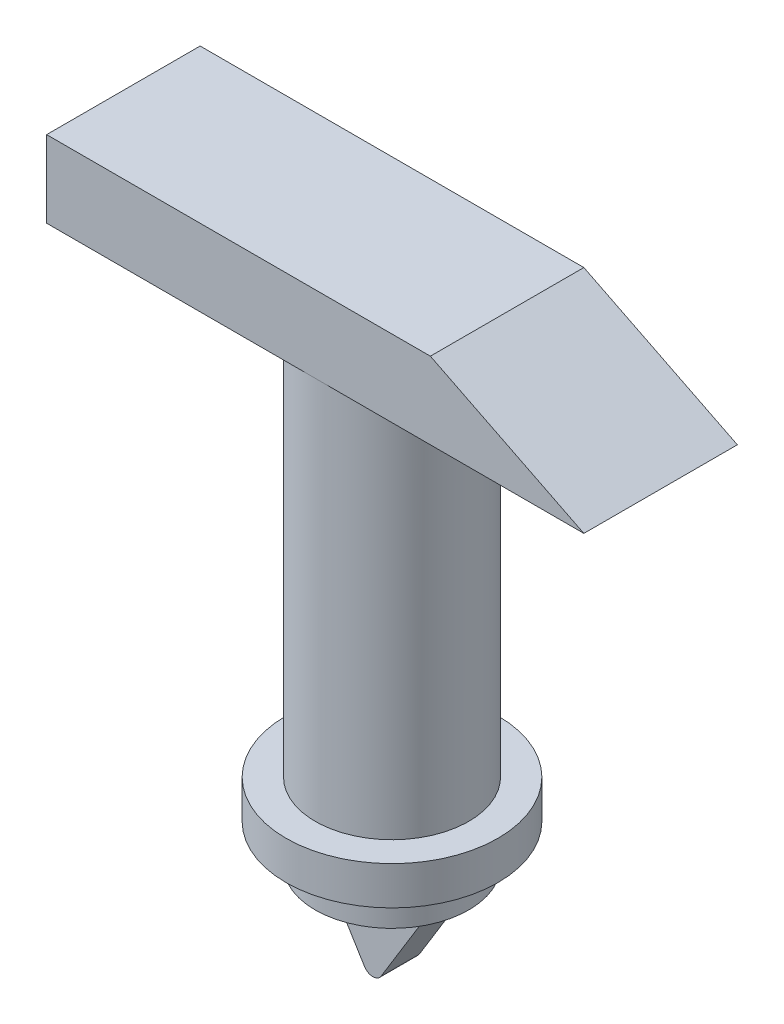
ISO-10303-21;
HEADER;
FILE_DESCRIPTION(('STEP AP214'),'2;1');
FILE_NAME('part.step','',(''),(''),'','','');
FILE_SCHEMA(('AUTOMOTIVE_DESIGN { 1 0 10303 214 1 1 1 1 }'));
ENDSEC;
DATA;
#1=APPLICATION_CONTEXT('core data for automotive mechanical design processes');
#2=APPLICATION_PROTOCOL_DEFINITION('international standard','automotive_design',2000,#1);
#3=PRODUCT_CONTEXT('',#1,'mechanical');
#4=PRODUCT('Part','Part','',(#3));
#5=PRODUCT_RELATED_PRODUCT_CATEGORY('part','',(#4));
#6=PRODUCT_DEFINITION_FORMATION('','',#4);
#7=PRODUCT_DEFINITION_CONTEXT('part definition',#1,'design');
#8=PRODUCT_DEFINITION('design','',#6,#7);
#9=PRODUCT_DEFINITION_SHAPE('','',#8);
#10=(LENGTH_UNIT() NAMED_UNIT(*) SI_UNIT(.MILLI.,.METRE.));
#11=(NAMED_UNIT(*) PLANE_ANGLE_UNIT() SI_UNIT($,.RADIAN.));
#12=(NAMED_UNIT(*) SI_UNIT($,.STERADIAN.) SOLID_ANGLE_UNIT());
#13=UNCERTAINTY_MEASURE_WITH_UNIT(LENGTH_MEASURE(1.E-05),#10,'distance_accuracy_value','');
#14=(GEOMETRIC_REPRESENTATION_CONTEXT(3) GLOBAL_UNCERTAINTY_ASSIGNED_CONTEXT((#13)) GLOBAL_UNIT_ASSIGNED_CONTEXT((#10,
#11,#12)) REPRESENTATION_CONTEXT('',''));
#15=CARTESIAN_POINT('',(0.,0.,0.));
#16=DIRECTION('',(0.,0.,1.));
#17=DIRECTION('',(1.,0.,0.));
#18=AXIS2_PLACEMENT_3D('',#15,#16,#17);
#19=CARTESIAN_POINT('',(0.,30.,0.));
#20=DIRECTION('',(0.,-1.,0.));
#21=DIRECTION('',(0.,0.,-1.));
#22=AXIS2_PLACEMENT_3D('',#19,#20,#21);
#23=CYLINDRICAL_SURFACE('',#22,10.);
#24=CARTESIAN_POINT('',(0.,-30.,0.));
#25=DIRECTION('',(0.,1.,0.));
#26=DIRECTION('',(0.,0.,1.));
#27=AXIS2_PLACEMENT_3D('',#24,#25,#26);
#28=CIRCLE('',#27,10.);
#29=CARTESIAN_POINT('',(0.,-30.,10.));
#30=VERTEX_POINT('',#29);
#31=EDGE_CURVE('E211',#30,#30,#28,.T.);
#32=ORIENTED_EDGE('',*,*,#31,.T.);
#33=EDGE_LOOP('',(#32));
#34=FACE_BOUND('',#33,.T.);
#35=CARTESIAN_POINT('',(0.,-25.,0.));
#36=DIRECTION('',(0.,1.,0.));
#37=DIRECTION('',(0.,0.,1.));
#38=AXIS2_PLACEMENT_3D('',#35,#36,#37);
#39=CIRCLE('',#38,10.);
#40=CARTESIAN_POINT('',(0.,-25.,10.));
#41=VERTEX_POINT('',#40);
#42=EDGE_CURVE('E11',#41,#41,#39,.T.);
#43=ORIENTED_EDGE('',*,*,#42,.F.);
#44=EDGE_LOOP('',(#43));
#45=FACE_BOUND('',#44,.T.);
#46=ADVANCED_FACE('F45',(#34,#45),#23,.T.);
#47=CARTESIAN_POINT('',(0.,-30.,0.));
#48=DIRECTION('',(0.,1.,0.));
#49=DIRECTION('',(0.,0.,1.));
#50=AXIS2_PLACEMENT_3D('',#47,#48,#49);
#51=PLANE('',#50);
#52=DIRECTION('',(0.,0.,-1.));
#53=VECTOR('',#52,1.);
#54=CARTESIAN_POINT('',(7.61999999999998,-30.,2.5));
#55=LINE('',#54,#53);
#56=CARTESIAN_POINT('',(7.61999999999998,-30.,2.5));
#57=VERTEX_POINT('',#56);
#58=CARTESIAN_POINT('',(7.61999999999998,-30.,-2.5));
#59=VERTEX_POINT('',#58);
#60=EDGE_CURVE('E203',#57,#59,#55,.T.);
#61=ORIENTED_EDGE('',*,*,#60,.T.);
#62=DIRECTION('',(-1.,0.,0.));
#63=VECTOR('',#62,1.);
#64=CARTESIAN_POINT('',(-7.62,-30.,-2.5));
#65=LINE('',#64,#63);
#66=CARTESIAN_POINT('',(-7.62,-30.,-2.5));
#67=VERTEX_POINT('',#66);
#68=EDGE_CURVE('E191',#59,#67,#65,.T.);
#69=ORIENTED_EDGE('',*,*,#68,.T.);
#70=DIRECTION('',(0.,0.,-1.));
#71=VECTOR('',#70,1.);
#72=CARTESIAN_POINT('',(-7.62,-30.,2.5));
#73=LINE('',#72,#71);
#74=CARTESIAN_POINT('',(-7.62,-30.,2.5));
#75=VERTEX_POINT('',#74);
#76=EDGE_CURVE('E200',#75,#67,#73,.T.);
#77=ORIENTED_EDGE('',*,*,#76,.F.);
#78=DIRECTION('',(-1.,0.,0.));
#79=VECTOR('',#78,1.);
#80=CARTESIAN_POINT('',(-7.62,-30.,2.5));
#81=LINE('',#80,#79);
#82=EDGE_CURVE('E177',#57,#75,#81,.T.);
#83=ORIENTED_EDGE('',*,*,#82,.F.);
#84=EDGE_LOOP('',(#61,#69,#77,#83));
#85=FACE_BOUND('',#84,.T.);
#86=ORIENTED_EDGE('',*,*,#31,.F.);
#87=EDGE_LOOP('',(#86));
#88=FACE_BOUND('',#87,.T.);
#89=ADVANCED_FACE('F235',(#85,#88),#51,.F.);
#90=CARTESIAN_POINT('',(0.,-40.,2.5));
#91=DIRECTION('',(0.,0.,-1.));
#92=DIRECTION('',(-1.,0.,0.));
#93=AXIS2_PLACEMENT_3D('',#90,#91,#92);
#94=CYLINDRICAL_SURFACE('',#93,1.27);
#95=CARTESIAN_POINT('',(0.,-40.,-2.5));
#96=DIRECTION('',(0.,0.,1.));
#97=DIRECTION('',(1.,0.,0.));
#98=AXIS2_PLACEMENT_3D('',#95,#96,#97);
#99=CIRCLE('',#98,1.27);
#100=CARTESIAN_POINT('',(-1.08273986438283,-40.6637577766597,-2.5));
#101=VERTEX_POINT('',#100);
#102=CARTESIAN_POINT('',(1.08273986438284,-40.6637577766597,-2.5));
#103=VERTEX_POINT('',#102);
#104=EDGE_CURVE('E168',#101,#103,#99,.T.);
#105=ORIENTED_EDGE('',*,*,#104,.T.);
#106=DIRECTION('',(0.,0.,-1.));
#107=VECTOR('',#106,1.);
#108=CARTESIAN_POINT('',(1.08273986438284,-40.6637577766597,2.5));
#109=LINE('',#108,#107);
#110=CARTESIAN_POINT('',(1.08273986438284,-40.6637577766597,2.5));
#111=VERTEX_POINT('',#110);
#112=EDGE_CURVE('E207',#111,#103,#109,.T.);
#113=ORIENTED_EDGE('',*,*,#112,.F.);
#114=CARTESIAN_POINT('',(0.,-40.,2.5));
#115=DIRECTION('',(0.,0.,1.));
#116=DIRECTION('',(1.,0.,0.));
#117=AXIS2_PLACEMENT_3D('',#114,#115,#116);
#118=CIRCLE('',#117,1.27);
#119=CARTESIAN_POINT('',(-1.08273986438283,-40.6637577766597,2.5));
#120=VERTEX_POINT('',#119);
#121=EDGE_CURVE('E169',#120,#111,#118,.T.);
#122=ORIENTED_EDGE('',*,*,#121,.F.);
#123=DIRECTION('',(0.,0.,-1.));
#124=VECTOR('',#123,1.);
#125=CARTESIAN_POINT('',(-1.08273986438283,-40.6637577766597,2.5));
#126=LINE('',#125,#124);
#127=EDGE_CURVE('E183',#120,#101,#126,.T.);
#128=ORIENTED_EDGE('',*,*,#127,.T.);
#129=EDGE_LOOP('',(#105,#113,#122,#128));
#130=FACE_BOUND('',#129,.T.);
#131=ADVANCED_FACE('F242',(#130),#94,.T.);
#132=CARTESIAN_POINT('',(1.08273986438284,-40.6637577766597,2.5));
#133=DIRECTION('',(-0.85255107431719,0.522643918629697,0.));
#134=DIRECTION('',(-0.522643918629697,-0.85255107431719,0.));
#135=AXIS2_PLACEMENT_3D('',#132,#133,#134);
#136=PLANE('',#135);
#137=DIRECTION('',(0.522643918629697,0.85255107431719,0.));
#138=VECTOR('',#137,1.);
#139=CARTESIAN_POINT('',(1.08273986438284,-40.6637577766597,-2.5));
#140=LINE('',#139,#138);
#141=EDGE_CURVE('E187',#103,#59,#140,.T.);
#142=ORIENTED_EDGE('',*,*,#141,.T.);
#143=ORIENTED_EDGE('',*,*,#60,.F.);
#144=DIRECTION('',(0.522643918629697,0.85255107431719,0.));
#145=VECTOR('',#144,1.);
#146=CARTESIAN_POINT('',(1.08273986438284,-40.6637577766597,2.5));
#147=LINE('',#146,#145);
#148=EDGE_CURVE('E173',#111,#57,#147,.T.);
#149=ORIENTED_EDGE('',*,*,#148,.F.);
#150=ORIENTED_EDGE('',*,*,#112,.T.);
#151=EDGE_LOOP('',(#142,#143,#149,#150));
#152=FACE_BOUND('',#151,.T.);
#153=ADVANCED_FACE('F268',(#152),#136,.F.);
#154=CARTESIAN_POINT('',(-1.08273986438283,-40.6637577766597,2.5));
#155=DIRECTION('',(0.852551074317189,0.522643918629698,0.));
#156=DIRECTION('',(-0.522643918629698,0.852551074317189,0.));
#157=AXIS2_PLACEMENT_3D('',#154,#155,#156);
#158=PLANE('',#157);
#159=DIRECTION('',(0.522643918629698,-0.852551074317189,0.));
#160=VECTOR('',#159,1.);
#161=CARTESIAN_POINT('',(-1.08273986438283,-40.6637577766597,-2.5));
#162=LINE('',#161,#160);
#163=EDGE_CURVE('E174',#67,#101,#162,.T.);
#164=ORIENTED_EDGE('',*,*,#163,.T.);
#165=ORIENTED_EDGE('',*,*,#127,.F.);
#166=DIRECTION('',(0.522643918629698,-0.852551074317189,0.));
#167=VECTOR('',#166,1.);
#168=CARTESIAN_POINT('',(-1.08273986438283,-40.6637577766597,2.5));
#169=LINE('',#168,#167);
#170=EDGE_CURVE('E180',#75,#120,#169,.T.);
#171=ORIENTED_EDGE('',*,*,#170,.F.);
#172=ORIENTED_EDGE('',*,*,#76,.T.);
#173=EDGE_LOOP('',(#164,#165,#171,#172));
#174=FACE_BOUND('',#173,.T.);
#175=ADVANCED_FACE('F263',(#174),#158,.F.);
#176=CARTESIAN_POINT('',(0.,-40.,2.5));
#177=DIRECTION('',(0.,0.,1.));
#178=DIRECTION('',(1.,0.,0.));
#179=AXIS2_PLACEMENT_3D('',#176,#177,#178);
#180=PLANE('',#179);
#181=ORIENTED_EDGE('',*,*,#121,.T.);
#182=ORIENTED_EDGE('',*,*,#148,.T.);
#183=ORIENTED_EDGE('',*,*,#82,.T.);
#184=ORIENTED_EDGE('',*,*,#170,.T.);
#185=EDGE_LOOP('',(#181,#182,#183,#184));
#186=FACE_BOUND('',#185,.T.);
#187=ADVANCED_FACE('F257',(#186),#180,.T.);
#188=CARTESIAN_POINT('',(0.,-40.,-2.5));
#189=DIRECTION('',(0.,0.,1.));
#190=DIRECTION('',(1.,0.,0.));
#191=AXIS2_PLACEMENT_3D('',#188,#189,#190);
#192=PLANE('',#191);
#193=ORIENTED_EDGE('',*,*,#104,.F.);
#194=ORIENTED_EDGE('',*,*,#163,.F.);
#195=ORIENTED_EDGE('',*,*,#68,.F.);
#196=ORIENTED_EDGE('',*,*,#141,.F.);
#197=EDGE_LOOP('',(#193,#194,#195,#196));
#198=FACE_BOUND('',#197,.T.);
#199=ADVANCED_FACE('F249',(#198),#192,.F.);
#200=CARTESIAN_POINT('',(10.,-25.,0.));
#201=DIRECTION('',(0.,1.,0.));
#202=DIRECTION('',(0.,0.,1.));
#203=AXIS2_PLACEMENT_3D('',#200,#201,#202);
#204=PLANE('',#203);
#205=CARTESIAN_POINT('',(0.,-25.,0.));
#206=DIRECTION('',(0.,1.,0.));
#207=DIRECTION('',(0.,0.,1.));
#208=AXIS2_PLACEMENT_3D('',#205,#206,#207);
#209=CIRCLE('',#208,13.81);
#210=CARTESIAN_POINT('',(0.,-25.,13.81));
#211=VERTEX_POINT('',#210);
#212=EDGE_CURVE('E164',#211,#211,#209,.T.);
#213=ORIENTED_EDGE('',*,*,#212,.F.);
#214=EDGE_LOOP('',(#213));
#215=FACE_BOUND('',#214,.T.);
#216=ORIENTED_EDGE('',*,*,#42,.T.);
#217=EDGE_LOOP('',(#216));
#218=FACE_BOUND('',#217,.T.);
#219=ADVANCED_FACE('F248',(#215,#218),#204,.F.);
#220=CARTESIAN_POINT('',(0.,-30.,0.));
#221=DIRECTION('',(0.,1.,0.));
#222=DIRECTION('',(0.,0.,1.));
#223=AXIS2_PLACEMENT_3D('',#220,#221,#222);
#224=CYLINDRICAL_SURFACE('',#223,13.81);
#225=CARTESIAN_POINT('',(0.,-20.,0.));
#226=DIRECTION('',(0.,1.,0.));
#227=DIRECTION('',(0.,0.,1.));
#228=AXIS2_PLACEMENT_3D('',#225,#226,#227);
#229=CIRCLE('',#228,13.81);
#230=CARTESIAN_POINT('',(0.,-20.,13.81));
#231=VERTEX_POINT('',#230);
#232=EDGE_CURVE('E160',#231,#231,#229,.T.);
#233=ORIENTED_EDGE('',*,*,#232,.F.);
#234=EDGE_LOOP('',(#233));
#235=FACE_BOUND('',#234,.T.);
#236=ORIENTED_EDGE('',*,*,#212,.T.);
#237=EDGE_LOOP('',(#236));
#238=FACE_BOUND('',#237,.T.);
#239=ADVANCED_FACE('F232',(#235,#238),#224,.T.);
#240=CARTESIAN_POINT('',(10.,-20.,0.));
#241=DIRECTION('',(0.,-1.,0.));
#242=DIRECTION('',(0.,0.,-1.));
#243=AXIS2_PLACEMENT_3D('',#240,#241,#242);
#244=PLANE('',#243);
#245=CARTESIAN_POINT('',(0.,-20.,0.));
#246=DIRECTION('',(0.,-1.,0.));
#247=DIRECTION('',(0.,0.,-1.));
#248=AXIS2_PLACEMENT_3D('',#245,#246,#247);
#249=CIRCLE('',#248,10.);
#250=CARTESIAN_POINT('',(0.,-20.,-10.));
#251=VERTEX_POINT('',#250);
#252=EDGE_CURVE('E53',#251,#251,#249,.T.);
#253=ORIENTED_EDGE('',*,*,#252,.T.);
#254=EDGE_LOOP('',(#253));
#255=FACE_BOUND('',#254,.T.);
#256=ORIENTED_EDGE('',*,*,#232,.T.);
#257=EDGE_LOOP('',(#256));
#258=FACE_BOUND('',#257,.T.);
#259=ADVANCED_FACE('F220',(#255,#258),#244,.F.);
#260=CARTESIAN_POINT('',(0.,30.,0.));
#261=DIRECTION('',(0.,1.,0.));
#262=DIRECTION('',(0.,0.,1.));
#263=AXIS2_PLACEMENT_3D('',#260,#261,#262);
#264=CIRCLE('',#263,10.);
#265=CARTESIAN_POINT('',(0.,30.,10.));
#266=VERTEX_POINT('',#265);
#267=CARTESIAN_POINT('',(0.,30.,-10.));
#268=VERTEX_POINT('',#267);
#269=EDGE_CURVE('E136',#266,#268,#264,.T.);
#270=ORIENTED_EDGE('',*,*,#269,.F.);
#271=EDGE_CURVE('E67',#268,#266,#264,.T.);
#272=ORIENTED_EDGE('',*,*,#271,.F.);
#273=EDGE_LOOP('',(#270,#272));
#274=FACE_BOUND('',#273,.T.);
#275=ORIENTED_EDGE('',*,*,#252,.F.);
#276=EDGE_LOOP('',(#275));
#277=FACE_BOUND('',#276,.T.);
#278=ADVANCED_FACE('F223',(#274,#277),#23,.T.);
#279=CARTESIAN_POINT('',(0.,30.,0.));
#280=DIRECTION('',(0.,-1.,0.));
#281=DIRECTION('',(0.,0.,-1.));
#282=AXIS2_PLACEMENT_3D('',#279,#280,#281);
#283=PLANE('',#282);
#284=DIRECTION('',(1.,0.,0.));
#285=VECTOR('',#284,1.);
#286=CARTESIAN_POINT('',(35.,30.,10.));
#287=LINE('',#286,#285);
#288=CARTESIAN_POINT('',(35.,30.,10.));
#289=VERTEX_POINT('',#288);
#290=EDGE_CURVE('E143',#266,#289,#287,.T.);
#291=ORIENTED_EDGE('',*,*,#290,.F.);
#292=ORIENTED_EDGE('',*,*,#269,.T.);
#293=DIRECTION('',(-1.,0.,0.));
#294=VECTOR('',#293,1.);
#295=CARTESIAN_POINT('',(35.,30.,-10.));
#296=LINE('',#295,#294);
#297=CARTESIAN_POINT('',(35.,30.,-10.));
#298=VERTEX_POINT('',#297);
#299=EDGE_CURVE('E130',#298,#268,#296,.T.);
#300=ORIENTED_EDGE('',*,*,#299,.F.);
#301=DIRECTION('',(0.,0.,-1.));
#302=VECTOR('',#301,1.);
#303=CARTESIAN_POINT('',(35.,30.,-10.));
#304=LINE('',#303,#302);
#305=EDGE_CURVE('E114',#289,#298,#304,.T.);
#306=ORIENTED_EDGE('',*,*,#305,.F.);
#307=EDGE_LOOP('',(#291,#292,#300,#306));
#308=FACE_BOUND('',#307,.T.);
#309=ADVANCED_FACE('F135',(#308),#283,.T.);
#310=CARTESIAN_POINT('',(35.,40.,-10.));
#311=DIRECTION('',(0.,0.,1.));
#312=DIRECTION('',(1.,0.,0.));
#313=AXIS2_PLACEMENT_3D('',#310,#311,#312);
#314=PLANE('',#313);
#315=DIRECTION('',(-1.,0.,0.));
#316=VECTOR('',#315,1.);
#317=CARTESIAN_POINT('',(35.,40.,-10.));
#318=LINE('',#317,#316);
#319=CARTESIAN_POINT('',(15.,40.,-10.));
#320=VERTEX_POINT('',#319);
#321=CARTESIAN_POINT('',(-35.,40.,-10.));
#322=VERTEX_POINT('',#321);
#323=EDGE_CURVE('E132',#320,#322,#318,.T.);
#324=ORIENTED_EDGE('',*,*,#323,.F.);
#325=DIRECTION('',(0.894427190999916,-0.447213595499958,0.));
#326=VECTOR('',#325,1.);
#327=CARTESIAN_POINT('',(35.,30.,-10.));
#328=LINE('',#327,#326);
#329=EDGE_CURVE('E60',#320,#298,#328,.T.);
#330=ORIENTED_EDGE('',*,*,#329,.T.);
#331=ORIENTED_EDGE('',*,*,#299,.T.);
#332=CARTESIAN_POINT('',(-35.,30.,-10.));
#333=VERTEX_POINT('',#332);
#334=EDGE_CURVE('E123',#268,#333,#296,.T.);
#335=ORIENTED_EDGE('',*,*,#334,.T.);
#336=DIRECTION('',(0.,-1.,0.));
#337=VECTOR('',#336,1.);
#338=CARTESIAN_POINT('',(-35.,40.,-10.));
#339=LINE('',#338,#337);
#340=EDGE_CURVE('E155',#322,#333,#339,.T.);
#341=ORIENTED_EDGE('',*,*,#340,.F.);
#342=EDGE_LOOP('',(#324,#330,#331,#335,#341));
#343=FACE_BOUND('',#342,.T.);
#344=ADVANCED_FACE('F129',(#343),#314,.F.);
#345=CARTESIAN_POINT('',(-35.,40.,-10.));
#346=DIRECTION('',(1.,0.,0.));
#347=DIRECTION('',(0.,0.,-1.));
#348=AXIS2_PLACEMENT_3D('',#345,#346,#347);
#349=PLANE('',#348);
#350=DIRECTION('',(0.,0.,1.));
#351=VECTOR('',#350,1.);
#352=CARTESIAN_POINT('',(-35.,30.,-10.));
#353=LINE('',#352,#351);
#354=CARTESIAN_POINT('',(-35.,30.,10.));
#355=VERTEX_POINT('',#354);
#356=EDGE_CURVE('E139',#333,#355,#353,.T.);
#357=ORIENTED_EDGE('',*,*,#356,.T.);
#358=DIRECTION('',(0.,-1.,0.));
#359=VECTOR('',#358,1.);
#360=CARTESIAN_POINT('',(-35.,40.,10.));
#361=LINE('',#360,#359);
#362=CARTESIAN_POINT('',(-35.,40.,10.));
#363=VERTEX_POINT('',#362);
#364=EDGE_CURVE('E151',#363,#355,#361,.T.);
#365=ORIENTED_EDGE('',*,*,#364,.F.);
#366=DIRECTION('',(0.,0.,1.));
#367=VECTOR('',#366,1.);
#368=CARTESIAN_POINT('',(-35.,40.,-10.));
#369=LINE('',#368,#367);
#370=EDGE_CURVE('E400',#322,#363,#369,.T.);
#371=ORIENTED_EDGE('',*,*,#370,.F.);
#372=ORIENTED_EDGE('',*,*,#340,.T.);
#373=EDGE_LOOP('',(#357,#365,#371,#372));
#374=FACE_BOUND('',#373,.T.);
#375=ADVANCED_FACE('F350',(#374),#349,.F.);
#376=CARTESIAN_POINT('',(35.,40.,10.));
#377=DIRECTION('',(0.,0.,-1.));
#378=DIRECTION('',(-1.,0.,0.));
#379=AXIS2_PLACEMENT_3D('',#376,#377,#378);
#380=PLANE('',#379);
#381=ORIENTED_EDGE('',*,*,#290,.T.);
#382=DIRECTION('',(0.894427190999916,-0.447213595499958,0.));
#383=VECTOR('',#382,1.);
#384=CARTESIAN_POINT('',(35.,30.,10.));
#385=LINE('',#384,#383);
#386=CARTESIAN_POINT('',(15.,40.,10.));
#387=VERTEX_POINT('',#386);
#388=EDGE_CURVE('E117',#387,#289,#385,.T.);
#389=ORIENTED_EDGE('',*,*,#388,.F.);
#390=DIRECTION('',(1.,0.,0.));
#391=VECTOR('',#390,1.);
#392=CARTESIAN_POINT('',(35.,40.,10.));
#393=LINE('',#392,#391);
#394=EDGE_CURVE('E156',#363,#387,#393,.T.);
#395=ORIENTED_EDGE('',*,*,#394,.F.);
#396=ORIENTED_EDGE('',*,*,#364,.T.);
#397=EDGE_CURVE('E147',#355,#266,#287,.T.);
#398=ORIENTED_EDGE('',*,*,#397,.T.);
#399=EDGE_LOOP('',(#381,#389,#395,#396,#398));
#400=FACE_BOUND('',#399,.T.);
#401=ADVANCED_FACE('F359',(#400),#380,.F.);
#402=CARTESIAN_POINT('',(0.,40.,0.));
#403=DIRECTION('',(0.,-1.,0.));
#404=DIRECTION('',(0.,0.,-1.));
#405=AXIS2_PLACEMENT_3D('',#402,#403,#404);
#406=PLANE('',#405);
#407=ORIENTED_EDGE('',*,*,#394,.T.);
#408=DIRECTION('',(0.,0.,1.));
#409=VECTOR('',#408,1.);
#410=CARTESIAN_POINT('',(15.,40.,-10.));
#411=LINE('',#410,#409);
#412=EDGE_CURVE('E124',#320,#387,#411,.T.);
#413=ORIENTED_EDGE('',*,*,#412,.F.);
#414=ORIENTED_EDGE('',*,*,#323,.T.);
#415=ORIENTED_EDGE('',*,*,#370,.T.);
#416=EDGE_LOOP('',(#407,#413,#414,#415));
#417=FACE_BOUND('',#416,.T.);
#418=ADVANCED_FACE('F368',(#417),#406,.F.);
#419=ORIENTED_EDGE('',*,*,#334,.F.);
#420=ORIENTED_EDGE('',*,*,#271,.T.);
#421=ORIENTED_EDGE('',*,*,#397,.F.);
#422=ORIENTED_EDGE('',*,*,#356,.F.);
#423=EDGE_LOOP('',(#419,#420,#421,#422));
#424=FACE_BOUND('',#423,.T.);
#425=ADVANCED_FACE('F231',(#424),#283,.T.);
#426=CARTESIAN_POINT('',(35.,30.,-10.));
#427=DIRECTION('',(-0.447213595499958,-0.894427190999916,0.));
#428=DIRECTION('',(0.894427190999916,-0.447213595499958,0.));
#429=AXIS2_PLACEMENT_3D('',#426,#427,#428);
#430=PLANE('',#429);
#431=ORIENTED_EDGE('',*,*,#388,.T.);
#432=ORIENTED_EDGE('',*,*,#305,.T.);
#433=ORIENTED_EDGE('',*,*,#329,.F.);
#434=ORIENTED_EDGE('',*,*,#412,.T.);
#435=EDGE_LOOP('',(#431,#432,#433,#434));
#436=FACE_BOUND('',#435,.T.);
#437=ADVANCED_FACE('F115',(#436),#430,.F.);
#438=CLOSED_SHELL('',(#46,#89,#131,#153,#175,#187,#199,#219,#239,#259,#278,#309,#344,#375,#401,
#418,#425,#437));
#439=MANIFOLD_SOLID_BREP('B2',#438);
#440=ADVANCED_BREP_SHAPE_REPRESENTATION('',(#18,#439),#14);
#441=SHAPE_DEFINITION_REPRESENTATION(#9,#440);
ENDSEC;
END-ISO-10303-21;
